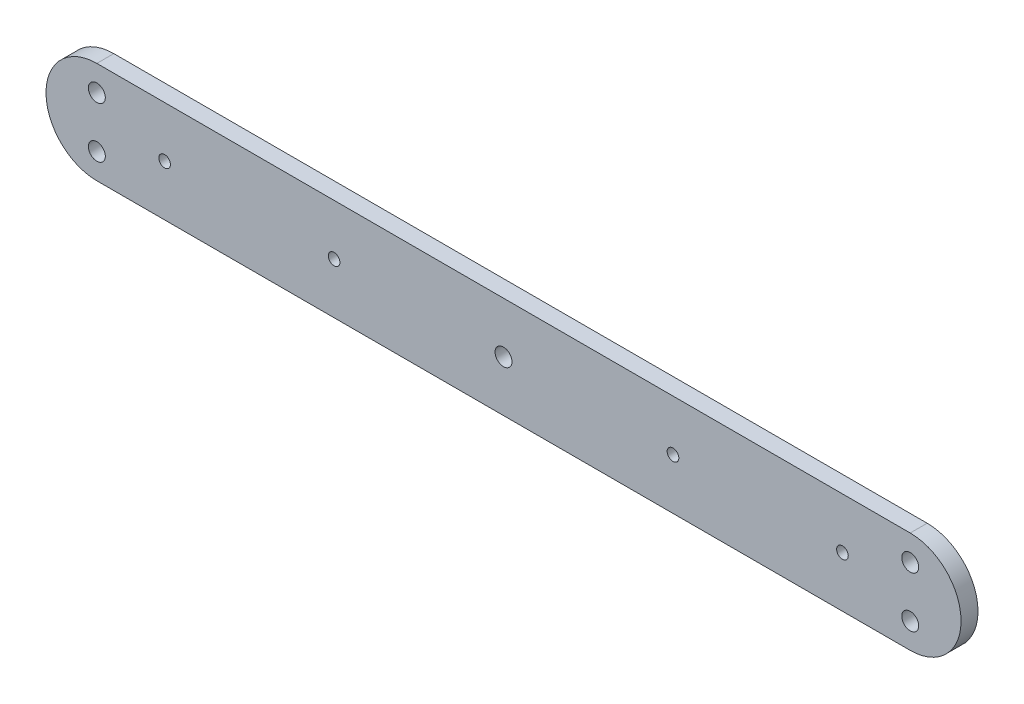
ISO-10303-21;
HEADER;
FILE_DESCRIPTION(('STEP AP214'),'2;1');
FILE_NAME('part.step','',(''),(''),'','','');
FILE_SCHEMA(('AUTOMOTIVE_DESIGN { 1 0 10303 214 1 1 1 1 }'));
ENDSEC;
DATA;
#1=APPLICATION_CONTEXT('core data for automotive mechanical design processes');
#2=APPLICATION_PROTOCOL_DEFINITION('international standard','automotive_design',2000,#1);
#3=PRODUCT_CONTEXT('',#1,'mechanical');
#4=PRODUCT('Part','Part','',(#3));
#5=PRODUCT_RELATED_PRODUCT_CATEGORY('part','',(#4));
#6=PRODUCT_DEFINITION_FORMATION('','',#4);
#7=PRODUCT_DEFINITION_CONTEXT('part definition',#1,'design');
#8=PRODUCT_DEFINITION('design','',#6,#7);
#9=PRODUCT_DEFINITION_SHAPE('','',#8);
#10=(LENGTH_UNIT() NAMED_UNIT(*) SI_UNIT(.MILLI.,.METRE.));
#11=(NAMED_UNIT(*) PLANE_ANGLE_UNIT() SI_UNIT($,.RADIAN.));
#12=(NAMED_UNIT(*) SI_UNIT($,.STERADIAN.) SOLID_ANGLE_UNIT());
#13=UNCERTAINTY_MEASURE_WITH_UNIT(LENGTH_MEASURE(1.E-05),#10,'distance_accuracy_value','');
#14=(GEOMETRIC_REPRESENTATION_CONTEXT(3) GLOBAL_UNCERTAINTY_ASSIGNED_CONTEXT((#13)) GLOBAL_UNIT_ASSIGNED_CONTEXT((#10,
#11,#12)) REPRESENTATION_CONTEXT('',''));
#15=CARTESIAN_POINT('',(0.,0.,0.));
#16=DIRECTION('',(0.,0.,1.));
#17=DIRECTION('',(1.,0.,0.));
#18=AXIS2_PLACEMENT_3D('',#15,#16,#17);
#19=CARTESIAN_POINT('',(-89.2432432432432,0.,6.35));
#20=DIRECTION('',(0.,0.,1.));
#21=DIRECTION('',(1.,0.,0.));
#22=AXIS2_PLACEMENT_3D('',#19,#20,#21);
#23=PLANE('',#22);
#24=CARTESIAN_POINT('',(-63.8432432432432,0.,6.35));
#25=DIRECTION('',(0.,0.,1.));
#26=DIRECTION('',(1.,0.,0.));
#27=AXIS2_PLACEMENT_3D('',#24,#25,#26);
#28=CIRCLE('',#27,2.1828125);
#29=CARTESIAN_POINT('',(-61.6604307432432,0.,6.35));
#30=VERTEX_POINT('',#29);
#31=EDGE_CURVE('E153',#30,#30,#28,.T.);
#32=ORIENTED_EDGE('',*,*,#31,.F.);
#33=EDGE_LOOP('',(#32));
#34=FACE_BOUND('',#33,.T.);
#35=CARTESIAN_POINT('',(126.656756756757,0.,6.35));
#36=DIRECTION('',(0.,0.,1.));
#37=DIRECTION('',(1.,0.,0.));
#38=AXIS2_PLACEMENT_3D('',#35,#36,#37);
#39=CIRCLE('',#38,2.1828125);
#40=CARTESIAN_POINT('',(128.839569256757,0.,6.35));
#41=VERTEX_POINT('',#40);
#42=EDGE_CURVE('E141',#41,#41,#39,.T.);
#43=ORIENTED_EDGE('',*,*,#42,.F.);
#44=EDGE_LOOP('',(#43));
#45=FACE_BOUND('',#44,.T.);
#46=CARTESIAN_POINT('',(-89.2432432432432,9.52500000000003,6.35));
#47=DIRECTION('',(0.,0.,1.));
#48=DIRECTION('',(1.,0.,0.));
#49=AXIS2_PLACEMENT_3D('',#46,#47,#48);
#50=CIRCLE('',#49,3.175);
#51=CARTESIAN_POINT('',(-86.0682432432432,9.52500000000003,6.35));
#52=VERTEX_POINT('',#51);
#53=EDGE_CURVE('E129',#52,#52,#50,.T.);
#54=ORIENTED_EDGE('',*,*,#53,.F.);
#55=EDGE_LOOP('',(#54));
#56=FACE_BOUND('',#55,.T.);
#57=CARTESIAN_POINT('',(63.1567567567568,0.,6.35));
#58=DIRECTION('',(0.,0.,1.));
#59=DIRECTION('',(1.,0.,0.));
#60=AXIS2_PLACEMENT_3D('',#57,#58,#59);
#61=CIRCLE('',#60,3.17500000000001);
#62=CARTESIAN_POINT('',(66.3317567567568,0.,6.35));
#63=VERTEX_POINT('',#62);
#64=EDGE_CURVE('E117',#63,#63,#61,.T.);
#65=ORIENTED_EDGE('',*,*,#64,.F.);
#66=EDGE_LOOP('',(#65));
#67=FACE_BOUND('',#66,.T.);
#68=CARTESIAN_POINT('',(-89.2432432432432,0.,6.35));
#69=DIRECTION('',(0.,0.,1.));
#70=DIRECTION('',(1.,0.,0.));
#71=AXIS2_PLACEMENT_3D('',#68,#69,#70);
#72=CIRCLE('',#71,19.05);
#73=CARTESIAN_POINT('',(-89.2432432432432,19.05,6.35));
#74=VERTEX_POINT('',#73);
#75=CARTESIAN_POINT('',(-89.2432432432432,-19.05,6.35));
#76=VERTEX_POINT('',#75);
#77=EDGE_CURVE('E87',#74,#76,#72,.T.);
#78=ORIENTED_EDGE('',*,*,#77,.T.);
#79=DIRECTION('',(1.,0.,0.));
#80=VECTOR('',#79,1.);
#81=CARTESIAN_POINT('',(-89.2432432432432,-19.05,6.35));
#82=LINE('',#81,#80);
#83=CARTESIAN_POINT('',(215.556756756757,-19.0500000000001,6.35));
#84=VERTEX_POINT('',#83);
#85=EDGE_CURVE('E82',#76,#84,#82,.T.);
#86=ORIENTED_EDGE('',*,*,#85,.T.);
#87=CARTESIAN_POINT('',(215.556756756757,0.,6.35));
#88=DIRECTION('',(0.,0.,1.));
#89=DIRECTION('',(1.,0.,0.));
#90=AXIS2_PLACEMENT_3D('',#87,#88,#89);
#91=CIRCLE('',#90,19.0500000000001);
#92=CARTESIAN_POINT('',(215.556756756757,19.0500000000001,6.35));
#93=VERTEX_POINT('',#92);
#94=EDGE_CURVE('E85',#84,#93,#91,.T.);
#95=ORIENTED_EDGE('',*,*,#94,.T.);
#96=DIRECTION('',(-1.,0.,0.));
#97=VECTOR('',#96,1.);
#98=CARTESIAN_POINT('',(-89.2432432432432,19.05,6.35));
#99=LINE('',#98,#97);
#100=EDGE_CURVE('E52',#93,#74,#99,.T.);
#101=ORIENTED_EDGE('',*,*,#100,.T.);
#102=EDGE_LOOP('',(#78,#86,#95,#101));
#103=FACE_BOUND('',#102,.T.);
#104=CARTESIAN_POINT('',(215.556756756757,-9.52500000000007,6.35));
#105=DIRECTION('',(0.,0.,1.));
#106=DIRECTION('',(1.,0.,0.));
#107=AXIS2_PLACEMENT_3D('',#104,#105,#106);
#108=CIRCLE('',#107,3.175);
#109=CARTESIAN_POINT('',(218.731756756757,-9.52500000000007,6.35));
#110=VERTEX_POINT('',#109);
#111=EDGE_CURVE('E102',#110,#110,#108,.T.);
#112=ORIENTED_EDGE('',*,*,#111,.F.);
#113=EDGE_LOOP('',(#112));
#114=FACE_BOUND('',#113,.T.);
#115=CARTESIAN_POINT('',(215.556756756757,9.52500000000007,6.35));
#116=DIRECTION('',(0.,0.,1.));
#117=DIRECTION('',(1.,0.,0.));
#118=AXIS2_PLACEMENT_3D('',#115,#116,#117);
#119=CIRCLE('',#118,3.175);
#120=CARTESIAN_POINT('',(218.731756756757,9.52500000000007,6.35));
#121=VERTEX_POINT('',#120);
#122=EDGE_CURVE('E123',#121,#121,#119,.T.);
#123=ORIENTED_EDGE('',*,*,#122,.F.);
#124=EDGE_LOOP('',(#123));
#125=FACE_BOUND('',#124,.T.);
#126=CARTESIAN_POINT('',(-0.34324324324321,0.,6.35));
#127=DIRECTION('',(0.,0.,1.));
#128=DIRECTION('',(1.,0.,0.));
#129=AXIS2_PLACEMENT_3D('',#126,#127,#128);
#130=CIRCLE('',#129,2.1828125);
#131=CARTESIAN_POINT('',(1.83956925675679,0.,6.35));
#132=VERTEX_POINT('',#131);
#133=EDGE_CURVE('E135',#132,#132,#130,.T.);
#134=ORIENTED_EDGE('',*,*,#133,.F.);
#135=EDGE_LOOP('',(#134));
#136=FACE_BOUND('',#135,.T.);
#137=CARTESIAN_POINT('',(-89.2432432432432,-9.525,6.35));
#138=DIRECTION('',(0.,0.,1.));
#139=DIRECTION('',(1.,0.,0.));
#140=AXIS2_PLACEMENT_3D('',#137,#138,#139);
#141=CIRCLE('',#140,3.175);
#142=CARTESIAN_POINT('',(-86.0682432432432,-9.525,6.35));
#143=VERTEX_POINT('',#142);
#144=EDGE_CURVE('E147',#143,#143,#141,.T.);
#145=ORIENTED_EDGE('',*,*,#144,.F.);
#146=EDGE_LOOP('',(#145));
#147=FACE_BOUND('',#146,.T.);
#148=CARTESIAN_POINT('',(190.156756756757,0.,6.35));
#149=DIRECTION('',(0.,0.,1.));
#150=DIRECTION('',(1.,0.,0.));
#151=AXIS2_PLACEMENT_3D('',#148,#149,#150);
#152=CIRCLE('',#151,2.1828125);
#153=CARTESIAN_POINT('',(192.339569256757,0.,6.35));
#154=VERTEX_POINT('',#153);
#155=EDGE_CURVE('E159',#154,#154,#152,.T.);
#156=ORIENTED_EDGE('',*,*,#155,.F.);
#157=EDGE_LOOP('',(#156));
#158=FACE_BOUND('',#157,.T.);
#159=ADVANCED_FACE('F35',(#34,#45,#56,#67,#103,#114,#125,#136,#147,#158),#23,.T.);
#160=CARTESIAN_POINT('',(-89.2432432432432,0.,0.));
#161=DIRECTION('',(0.,0.,1.));
#162=DIRECTION('',(1.,0.,0.));
#163=AXIS2_PLACEMENT_3D('',#160,#161,#162);
#164=PLANE('',#163);
#165=CARTESIAN_POINT('',(-89.2432432432432,0.,0.));
#166=DIRECTION('',(0.,0.,1.));
#167=DIRECTION('',(1.,0.,0.));
#168=AXIS2_PLACEMENT_3D('',#165,#166,#167);
#169=CIRCLE('',#168,19.05);
#170=CARTESIAN_POINT('',(-89.2432432432432,19.05,0.));
#171=VERTEX_POINT('',#170);
#172=CARTESIAN_POINT('',(-89.2432432432432,-19.05,0.));
#173=VERTEX_POINT('',#172);
#174=EDGE_CURVE('E99',#171,#173,#169,.T.);
#175=ORIENTED_EDGE('',*,*,#174,.F.);
#176=DIRECTION('',(-1.,0.,0.));
#177=VECTOR('',#176,1.);
#178=CARTESIAN_POINT('',(-89.2432432432432,19.05,0.));
#179=LINE('',#178,#177);
#180=CARTESIAN_POINT('',(215.556756756757,19.0500000000001,0.));
#181=VERTEX_POINT('',#180);
#182=EDGE_CURVE('E75',#181,#171,#179,.T.);
#183=ORIENTED_EDGE('',*,*,#182,.F.);
#184=CARTESIAN_POINT('',(215.556756756757,0.,0.));
#185=DIRECTION('',(0.,0.,1.));
#186=DIRECTION('',(1.,0.,0.));
#187=AXIS2_PLACEMENT_3D('',#184,#185,#186);
#188=CIRCLE('',#187,19.0500000000001);
#189=CARTESIAN_POINT('',(215.556756756757,-19.0500000000001,0.));
#190=VERTEX_POINT('',#189);
#191=EDGE_CURVE('E69',#190,#181,#188,.T.);
#192=ORIENTED_EDGE('',*,*,#191,.F.);
#193=DIRECTION('',(1.,0.,0.));
#194=VECTOR('',#193,1.);
#195=CARTESIAN_POINT('',(-89.2432432432432,-19.05,0.));
#196=LINE('',#195,#194);
#197=EDGE_CURVE('E91',#173,#190,#196,.T.);
#198=ORIENTED_EDGE('',*,*,#197,.F.);
#199=EDGE_LOOP('',(#175,#183,#192,#198));
#200=FACE_BOUND('',#199,.T.);
#201=CARTESIAN_POINT('',(215.556756756757,-9.52500000000007,0.));
#202=DIRECTION('',(0.,0.,1.));
#203=DIRECTION('',(1.,0.,0.));
#204=AXIS2_PLACEMENT_3D('',#201,#202,#203);
#205=CIRCLE('',#204,3.175);
#206=CARTESIAN_POINT('',(218.731756756757,-9.52500000000007,0.));
#207=VERTEX_POINT('',#206);
#208=EDGE_CURVE('E114',#207,#207,#205,.T.);
#209=ORIENTED_EDGE('',*,*,#208,.T.);
#210=EDGE_LOOP('',(#209));
#211=FACE_BOUND('',#210,.T.);
#212=CARTESIAN_POINT('',(63.1567567567568,0.,0.));
#213=DIRECTION('',(0.,0.,1.));
#214=DIRECTION('',(1.,0.,0.));
#215=AXIS2_PLACEMENT_3D('',#212,#213,#214);
#216=CIRCLE('',#215,3.17500000000001);
#217=CARTESIAN_POINT('',(66.3317567567568,0.,0.));
#218=VERTEX_POINT('',#217);
#219=EDGE_CURVE('E120',#218,#218,#216,.T.);
#220=ORIENTED_EDGE('',*,*,#219,.T.);
#221=EDGE_LOOP('',(#220));
#222=FACE_BOUND('',#221,.T.);
#223=CARTESIAN_POINT('',(215.556756756757,9.52500000000007,0.));
#224=DIRECTION('',(0.,0.,1.));
#225=DIRECTION('',(1.,0.,0.));
#226=AXIS2_PLACEMENT_3D('',#223,#224,#225);
#227=CIRCLE('',#226,3.175);
#228=CARTESIAN_POINT('',(218.731756756757,9.52500000000007,0.));
#229=VERTEX_POINT('',#228);
#230=EDGE_CURVE('E126',#229,#229,#227,.T.);
#231=ORIENTED_EDGE('',*,*,#230,.T.);
#232=EDGE_LOOP('',(#231));
#233=FACE_BOUND('',#232,.T.);
#234=CARTESIAN_POINT('',(-89.2432432432432,9.52500000000003,0.));
#235=DIRECTION('',(0.,0.,1.));
#236=DIRECTION('',(1.,0.,0.));
#237=AXIS2_PLACEMENT_3D('',#234,#235,#236);
#238=CIRCLE('',#237,3.175);
#239=CARTESIAN_POINT('',(-86.0682432432432,9.52500000000003,0.));
#240=VERTEX_POINT('',#239);
#241=EDGE_CURVE('E132',#240,#240,#238,.T.);
#242=ORIENTED_EDGE('',*,*,#241,.T.);
#243=EDGE_LOOP('',(#242));
#244=FACE_BOUND('',#243,.T.);
#245=CARTESIAN_POINT('',(-0.34324324324321,0.,0.));
#246=DIRECTION('',(0.,0.,1.));
#247=DIRECTION('',(1.,0.,0.));
#248=AXIS2_PLACEMENT_3D('',#245,#246,#247);
#249=CIRCLE('',#248,2.1828125);
#250=CARTESIAN_POINT('',(1.83956925675679,0.,0.));
#251=VERTEX_POINT('',#250);
#252=EDGE_CURVE('E138',#251,#251,#249,.T.);
#253=ORIENTED_EDGE('',*,*,#252,.T.);
#254=EDGE_LOOP('',(#253));
#255=FACE_BOUND('',#254,.T.);
#256=CARTESIAN_POINT('',(126.656756756757,0.,0.));
#257=DIRECTION('',(0.,0.,1.));
#258=DIRECTION('',(1.,0.,0.));
#259=AXIS2_PLACEMENT_3D('',#256,#257,#258);
#260=CIRCLE('',#259,2.1828125);
#261=CARTESIAN_POINT('',(128.839569256757,0.,0.));
#262=VERTEX_POINT('',#261);
#263=EDGE_CURVE('E144',#262,#262,#260,.T.);
#264=ORIENTED_EDGE('',*,*,#263,.T.);
#265=EDGE_LOOP('',(#264));
#266=FACE_BOUND('',#265,.T.);
#267=CARTESIAN_POINT('',(-89.2432432432432,-9.525,0.));
#268=DIRECTION('',(0.,0.,1.));
#269=DIRECTION('',(1.,0.,0.));
#270=AXIS2_PLACEMENT_3D('',#267,#268,#269);
#271=CIRCLE('',#270,3.175);
#272=CARTESIAN_POINT('',(-86.0682432432432,-9.525,0.));
#273=VERTEX_POINT('',#272);
#274=EDGE_CURVE('E150',#273,#273,#271,.T.);
#275=ORIENTED_EDGE('',*,*,#274,.T.);
#276=EDGE_LOOP('',(#275));
#277=FACE_BOUND('',#276,.T.);
#278=CARTESIAN_POINT('',(-63.8432432432432,0.,0.));
#279=DIRECTION('',(0.,0.,1.));
#280=DIRECTION('',(1.,0.,0.));
#281=AXIS2_PLACEMENT_3D('',#278,#279,#280);
#282=CIRCLE('',#281,2.1828125);
#283=CARTESIAN_POINT('',(-61.6604307432432,0.,0.));
#284=VERTEX_POINT('',#283);
#285=EDGE_CURVE('E156',#284,#284,#282,.T.);
#286=ORIENTED_EDGE('',*,*,#285,.T.);
#287=EDGE_LOOP('',(#286));
#288=FACE_BOUND('',#287,.T.);
#289=CARTESIAN_POINT('',(190.156756756757,0.,0.));
#290=DIRECTION('',(0.,0.,1.));
#291=DIRECTION('',(1.,0.,0.));
#292=AXIS2_PLACEMENT_3D('',#289,#290,#291);
#293=CIRCLE('',#292,2.1828125);
#294=CARTESIAN_POINT('',(192.339569256757,0.,0.));
#295=VERTEX_POINT('',#294);
#296=EDGE_CURVE('E162',#295,#295,#293,.T.);
#297=ORIENTED_EDGE('',*,*,#296,.T.);
#298=EDGE_LOOP('',(#297));
#299=FACE_BOUND('',#298,.T.);
#300=ADVANCED_FACE('F110',(#200,#211,#222,#233,#244,#255,#266,#277,#288,#299),#164,.F.);
#301=CARTESIAN_POINT('',(-89.2432432432432,0.,6.35));
#302=DIRECTION('',(0.,0.,-1.));
#303=DIRECTION('',(-1.,0.,0.));
#304=AXIS2_PLACEMENT_3D('',#301,#302,#303);
#305=CYLINDRICAL_SURFACE('',#304,19.05);
#306=ORIENTED_EDGE('',*,*,#174,.T.);
#307=DIRECTION('',(0.,0.,-1.));
#308=VECTOR('',#307,1.);
#309=CARTESIAN_POINT('',(-89.2432432432432,-19.05,6.35));
#310=LINE('',#309,#308);
#311=EDGE_CURVE('E11',#76,#173,#310,.T.);
#312=ORIENTED_EDGE('',*,*,#311,.F.);
#313=ORIENTED_EDGE('',*,*,#77,.F.);
#314=DIRECTION('',(0.,0.,-1.));
#315=VECTOR('',#314,1.);
#316=CARTESIAN_POINT('',(-89.2432432432432,19.05,6.35));
#317=LINE('',#316,#315);
#318=EDGE_CURVE('E95',#74,#171,#317,.T.);
#319=ORIENTED_EDGE('',*,*,#318,.T.);
#320=EDGE_LOOP('',(#306,#312,#313,#319));
#321=FACE_BOUND('',#320,.T.);
#322=ADVANCED_FACE('F37',(#321),#305,.T.);
#323=CARTESIAN_POINT('',(-89.2432432432432,-19.05,6.35));
#324=DIRECTION('',(0.,1.,0.));
#325=DIRECTION('',(-1.,0.,0.));
#326=AXIS2_PLACEMENT_3D('',#323,#324,#325);
#327=PLANE('',#326);
#328=ORIENTED_EDGE('',*,*,#197,.T.);
#329=DIRECTION('',(0.,0.,-1.));
#330=VECTOR('',#329,1.);
#331=CARTESIAN_POINT('',(215.556756756757,-19.0500000000001,6.35));
#332=LINE('',#331,#330);
#333=EDGE_CURVE('E44',#84,#190,#332,.T.);
#334=ORIENTED_EDGE('',*,*,#333,.F.);
#335=ORIENTED_EDGE('',*,*,#85,.F.);
#336=ORIENTED_EDGE('',*,*,#311,.T.);
#337=EDGE_LOOP('',(#328,#334,#335,#336));
#338=FACE_BOUND('',#337,.T.);
#339=ADVANCED_FACE('F90',(#338),#327,.F.);
#340=CARTESIAN_POINT('',(215.556756756757,0.,6.35));
#341=DIRECTION('',(0.,0.,-1.));
#342=DIRECTION('',(-1.,0.,0.));
#343=AXIS2_PLACEMENT_3D('',#340,#341,#342);
#344=CYLINDRICAL_SURFACE('',#343,19.0500000000001);
#345=ORIENTED_EDGE('',*,*,#191,.T.);
#346=DIRECTION('',(0.,0.,-1.));
#347=VECTOR('',#346,1.);
#348=CARTESIAN_POINT('',(215.556756756757,19.0500000000001,6.35));
#349=LINE('',#348,#347);
#350=EDGE_CURVE('E92',#93,#181,#349,.T.);
#351=ORIENTED_EDGE('',*,*,#350,.F.);
#352=ORIENTED_EDGE('',*,*,#94,.F.);
#353=ORIENTED_EDGE('',*,*,#333,.T.);
#354=EDGE_LOOP('',(#345,#351,#352,#353));
#355=FACE_BOUND('',#354,.T.);
#356=ADVANCED_FACE('F93',(#355),#344,.T.);
#357=CARTESIAN_POINT('',(-89.2432432432432,19.05,6.35));
#358=DIRECTION('',(0.,-1.,0.));
#359=DIRECTION('',(1.,0.,0.));
#360=AXIS2_PLACEMENT_3D('',#357,#358,#359);
#361=PLANE('',#360);
#362=ORIENTED_EDGE('',*,*,#182,.T.);
#363=ORIENTED_EDGE('',*,*,#318,.F.);
#364=ORIENTED_EDGE('',*,*,#100,.F.);
#365=ORIENTED_EDGE('',*,*,#350,.T.);
#366=EDGE_LOOP('',(#362,#363,#364,#365));
#367=FACE_BOUND('',#366,.T.);
#368=ADVANCED_FACE('F107',(#367),#361,.F.);
#369=CARTESIAN_POINT('',(215.556756756757,-9.52500000000007,6.35));
#370=DIRECTION('',(0.,0.,-1.));
#371=DIRECTION('',(-1.,0.,0.));
#372=AXIS2_PLACEMENT_3D('',#369,#370,#371);
#373=CYLINDRICAL_SURFACE('',#372,3.175);
#374=ORIENTED_EDGE('',*,*,#111,.T.);
#375=EDGE_LOOP('',(#374));
#376=FACE_BOUND('',#375,.T.);
#377=ORIENTED_EDGE('',*,*,#208,.F.);
#378=EDGE_LOOP('',(#377));
#379=FACE_BOUND('',#378,.T.);
#380=ADVANCED_FACE('F181',(#376,#379),#373,.F.);
#381=CARTESIAN_POINT('',(63.1567567567568,0.,6.35));
#382=DIRECTION('',(0.,0.,-1.));
#383=DIRECTION('',(-1.,0.,0.));
#384=AXIS2_PLACEMENT_3D('',#381,#382,#383);
#385=CYLINDRICAL_SURFACE('',#384,3.17500000000001);
#386=ORIENTED_EDGE('',*,*,#64,.T.);
#387=EDGE_LOOP('',(#386));
#388=FACE_BOUND('',#387,.T.);
#389=ORIENTED_EDGE('',*,*,#219,.F.);
#390=EDGE_LOOP('',(#389));
#391=FACE_BOUND('',#390,.T.);
#392=ADVANCED_FACE('F227',(#388,#391),#385,.F.);
#393=CARTESIAN_POINT('',(215.556756756757,9.52500000000007,6.35));
#394=DIRECTION('',(0.,0.,-1.));
#395=DIRECTION('',(-1.,0.,0.));
#396=AXIS2_PLACEMENT_3D('',#393,#394,#395);
#397=CYLINDRICAL_SURFACE('',#396,3.175);
#398=ORIENTED_EDGE('',*,*,#122,.T.);
#399=EDGE_LOOP('',(#398));
#400=FACE_BOUND('',#399,.T.);
#401=ORIENTED_EDGE('',*,*,#230,.F.);
#402=EDGE_LOOP('',(#401));
#403=FACE_BOUND('',#402,.T.);
#404=ADVANCED_FACE('F235',(#400,#403),#397,.F.);
#405=CARTESIAN_POINT('',(-89.2432432432432,9.52500000000003,6.35));
#406=DIRECTION('',(0.,0.,-1.));
#407=DIRECTION('',(-1.,0.,0.));
#408=AXIS2_PLACEMENT_3D('',#405,#406,#407);
#409=CYLINDRICAL_SURFACE('',#408,3.175);
#410=ORIENTED_EDGE('',*,*,#53,.T.);
#411=EDGE_LOOP('',(#410));
#412=FACE_BOUND('',#411,.T.);
#413=ORIENTED_EDGE('',*,*,#241,.F.);
#414=EDGE_LOOP('',(#413));
#415=FACE_BOUND('',#414,.T.);
#416=ADVANCED_FACE('F243',(#412,#415),#409,.F.);
#417=CARTESIAN_POINT('',(-0.34324324324321,0.,6.35));
#418=DIRECTION('',(0.,0.,-1.));
#419=DIRECTION('',(-1.,0.,0.));
#420=AXIS2_PLACEMENT_3D('',#417,#418,#419);
#421=CYLINDRICAL_SURFACE('',#420,2.1828125);
#422=ORIENTED_EDGE('',*,*,#133,.T.);
#423=EDGE_LOOP('',(#422));
#424=FACE_BOUND('',#423,.T.);
#425=ORIENTED_EDGE('',*,*,#252,.F.);
#426=EDGE_LOOP('',(#425));
#427=FACE_BOUND('',#426,.T.);
#428=ADVANCED_FACE('F252',(#424,#427),#421,.F.);
#429=CARTESIAN_POINT('',(126.656756756757,0.,6.35));
#430=DIRECTION('',(0.,0.,-1.));
#431=DIRECTION('',(-1.,0.,0.));
#432=AXIS2_PLACEMENT_3D('',#429,#430,#431);
#433=CYLINDRICAL_SURFACE('',#432,2.1828125);
#434=ORIENTED_EDGE('',*,*,#42,.T.);
#435=EDGE_LOOP('',(#434));
#436=FACE_BOUND('',#435,.T.);
#437=ORIENTED_EDGE('',*,*,#263,.F.);
#438=EDGE_LOOP('',(#437));
#439=FACE_BOUND('',#438,.T.);
#440=ADVANCED_FACE('F261',(#436,#439),#433,.F.);
#441=CARTESIAN_POINT('',(-89.2432432432432,-9.525,6.35));
#442=DIRECTION('',(0.,0.,-1.));
#443=DIRECTION('',(-1.,0.,0.));
#444=AXIS2_PLACEMENT_3D('',#441,#442,#443);
#445=CYLINDRICAL_SURFACE('',#444,3.175);
#446=ORIENTED_EDGE('',*,*,#144,.T.);
#447=EDGE_LOOP('',(#446));
#448=FACE_BOUND('',#447,.T.);
#449=ORIENTED_EDGE('',*,*,#274,.F.);
#450=EDGE_LOOP('',(#449));
#451=FACE_BOUND('',#450,.T.);
#452=ADVANCED_FACE('F270',(#448,#451),#445,.F.);
#453=CARTESIAN_POINT('',(-63.8432432432432,0.,6.35));
#454=DIRECTION('',(0.,0.,-1.));
#455=DIRECTION('',(-1.,0.,0.));
#456=AXIS2_PLACEMENT_3D('',#453,#454,#455);
#457=CYLINDRICAL_SURFACE('',#456,2.1828125);
#458=ORIENTED_EDGE('',*,*,#31,.T.);
#459=EDGE_LOOP('',(#458));
#460=FACE_BOUND('',#459,.T.);
#461=ORIENTED_EDGE('',*,*,#285,.F.);
#462=EDGE_LOOP('',(#461));
#463=FACE_BOUND('',#462,.T.);
#464=ADVANCED_FACE('F279',(#460,#463),#457,.F.);
#465=CARTESIAN_POINT('',(190.156756756757,0.,6.35));
#466=DIRECTION('',(0.,0.,-1.));
#467=DIRECTION('',(-1.,0.,0.));
#468=AXIS2_PLACEMENT_3D('',#465,#466,#467);
#469=CYLINDRICAL_SURFACE('',#468,2.1828125);
#470=ORIENTED_EDGE('',*,*,#155,.T.);
#471=EDGE_LOOP('',(#470));
#472=FACE_BOUND('',#471,.T.);
#473=ORIENTED_EDGE('',*,*,#296,.F.);
#474=EDGE_LOOP('',(#473));
#475=FACE_BOUND('',#474,.T.);
#476=ADVANCED_FACE('F168',(#472,#475),#469,.F.);
#477=CLOSED_SHELL('',(#159,#300,#322,#339,#356,#368,#380,#392,#404,#416,#428,#440,#452,#464,#476));
#478=MANIFOLD_SOLID_BREP('B2',#477);
#479=ADVANCED_BREP_SHAPE_REPRESENTATION('',(#18,#478),#14);
#480=SHAPE_DEFINITION_REPRESENTATION(#9,#479);
ENDSEC;
END-ISO-10303-21;
